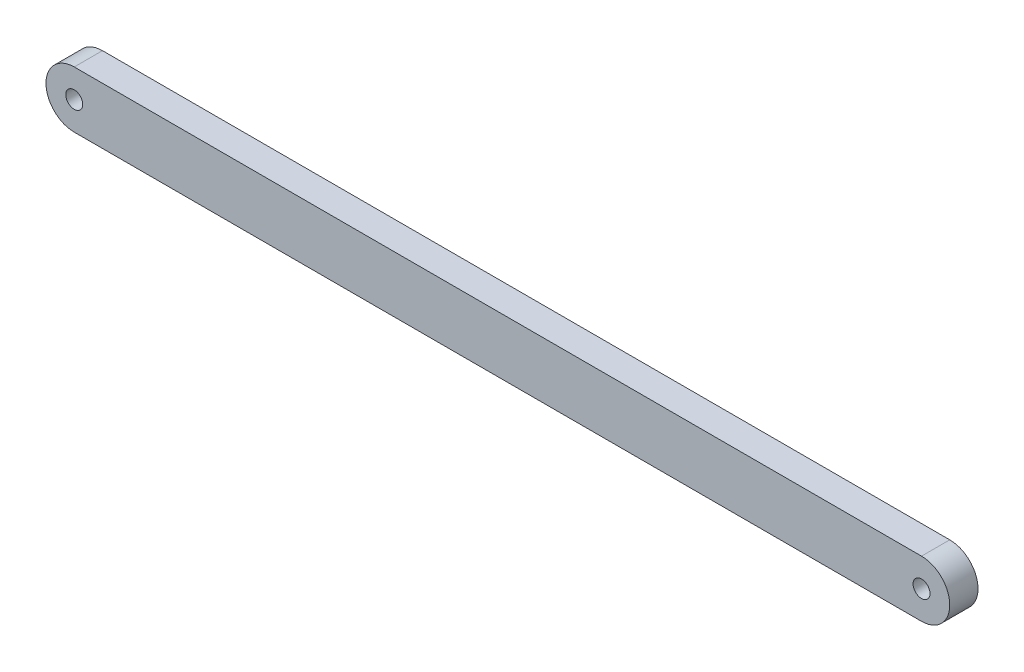
ISO-10303-21;
HEADER;
FILE_DESCRIPTION(('STEP AP214'),'2;1');
FILE_NAME('part.step','',(''),(''),'','','');
FILE_SCHEMA(('AUTOMOTIVE_DESIGN { 1 0 10303 214 1 1 1 1 }'));
ENDSEC;
DATA;
#1=APPLICATION_CONTEXT('core data for automotive mechanical design processes');
#2=APPLICATION_PROTOCOL_DEFINITION('international standard','automotive_design',2000,#1);
#3=PRODUCT_CONTEXT('',#1,'mechanical');
#4=PRODUCT('Part','Part','',(#3));
#5=PRODUCT_RELATED_PRODUCT_CATEGORY('part','',(#4));
#6=PRODUCT_DEFINITION_FORMATION('','',#4);
#7=PRODUCT_DEFINITION_CONTEXT('part definition',#1,'design');
#8=PRODUCT_DEFINITION('design','',#6,#7);
#9=PRODUCT_DEFINITION_SHAPE('','',#8);
#10=(LENGTH_UNIT() NAMED_UNIT(*) SI_UNIT(.MILLI.,.METRE.));
#11=(NAMED_UNIT(*) PLANE_ANGLE_UNIT() SI_UNIT($,.RADIAN.));
#12=(NAMED_UNIT(*) SI_UNIT($,.STERADIAN.) SOLID_ANGLE_UNIT());
#13=UNCERTAINTY_MEASURE_WITH_UNIT(LENGTH_MEASURE(1.E-05),#10,'distance_accuracy_value','');
#14=(GEOMETRIC_REPRESENTATION_CONTEXT(3) GLOBAL_UNCERTAINTY_ASSIGNED_CONTEXT((#13)) GLOBAL_UNIT_ASSIGNED_CONTEXT((#10,
#11,#12)) REPRESENTATION_CONTEXT('',''));
#15=CARTESIAN_POINT('',(0.,0.,0.));
#16=DIRECTION('',(0.,0.,1.));
#17=DIRECTION('',(1.,0.,0.));
#18=AXIS2_PLACEMENT_3D('',#15,#16,#17);
#19=CARTESIAN_POINT('',(-75.,0.,5.));
#20=DIRECTION('',(0.,0.,1.));
#21=DIRECTION('',(1.,0.,0.));
#22=AXIS2_PLACEMENT_3D('',#19,#20,#21);
#23=PLANE('',#22);
#24=CARTESIAN_POINT('',(-75.,0.,5.));
#25=DIRECTION('',(0.,0.,1.));
#26=DIRECTION('',(1.,0.,0.));
#27=AXIS2_PLACEMENT_3D('',#24,#25,#26);
#28=CIRCLE('',#27,1.5);
#29=CARTESIAN_POINT('',(-73.5,0.,5.));
#30=VERTEX_POINT('',#29);
#31=EDGE_CURVE('E104',#30,#30,#28,.T.);
#32=ORIENTED_EDGE('',*,*,#31,.F.);
#33=EDGE_LOOP('',(#32));
#34=FACE_BOUND('',#33,.T.);
#35=CARTESIAN_POINT('',(-75.,0.,5.));
#36=DIRECTION('',(0.,0.,1.));
#37=DIRECTION('',(1.,0.,0.));
#38=AXIS2_PLACEMENT_3D('',#35,#36,#37);
#39=CIRCLE('',#38,5.);
#40=CARTESIAN_POINT('',(-75.,5.,5.));
#41=VERTEX_POINT('',#40);
#42=CARTESIAN_POINT('',(-75.,-5.,5.));
#43=VERTEX_POINT('',#42);
#44=EDGE_CURVE('E89',#41,#43,#39,.T.);
#45=ORIENTED_EDGE('',*,*,#44,.T.);
#46=DIRECTION('',(1.,0.,0.));
#47=VECTOR('',#46,1.);
#48=CARTESIAN_POINT('',(-75.,-5.,5.));
#49=LINE('',#48,#47);
#50=CARTESIAN_POINT('',(75.,-5.,5.));
#51=VERTEX_POINT('',#50);
#52=EDGE_CURVE('E84',#43,#51,#49,.T.);
#53=ORIENTED_EDGE('',*,*,#52,.T.);
#54=CARTESIAN_POINT('',(75.,0.,5.));
#55=DIRECTION('',(0.,0.,1.));
#56=DIRECTION('',(1.,0.,0.));
#57=AXIS2_PLACEMENT_3D('',#54,#55,#56);
#58=CIRCLE('',#57,5.);
#59=CARTESIAN_POINT('',(75.,5.,5.));
#60=VERTEX_POINT('',#59);
#61=EDGE_CURVE('E87',#51,#60,#58,.T.);
#62=ORIENTED_EDGE('',*,*,#61,.T.);
#63=DIRECTION('',(-1.,0.,0.));
#64=VECTOR('',#63,1.);
#65=CARTESIAN_POINT('',(-75.,5.,5.));
#66=LINE('',#65,#64);
#67=EDGE_CURVE('E54',#60,#41,#66,.T.);
#68=ORIENTED_EDGE('',*,*,#67,.T.);
#69=EDGE_LOOP('',(#45,#53,#62,#68));
#70=FACE_BOUND('',#69,.T.);
#71=CARTESIAN_POINT('',(75.,0.,5.));
#72=DIRECTION('',(0.,0.,1.));
#73=DIRECTION('',(1.,0.,0.));
#74=AXIS2_PLACEMENT_3D('',#71,#72,#73);
#75=CIRCLE('',#74,1.5);
#76=CARTESIAN_POINT('',(76.5,0.,5.));
#77=VERTEX_POINT('',#76);
#78=EDGE_CURVE('E119',#77,#77,#75,.T.);
#79=ORIENTED_EDGE('',*,*,#78,.F.);
#80=EDGE_LOOP('',(#79));
#81=FACE_BOUND('',#80,.T.);
#82=ADVANCED_FACE('F37',(#34,#70,#81),#23,.T.);
#83=CARTESIAN_POINT('',(-75.,0.,0.));
#84=DIRECTION('',(0.,0.,1.));
#85=DIRECTION('',(1.,0.,0.));
#86=AXIS2_PLACEMENT_3D('',#83,#84,#85);
#87=PLANE('',#86);
#88=CARTESIAN_POINT('',(-75.,0.,0.));
#89=DIRECTION('',(0.,0.,1.));
#90=DIRECTION('',(1.,0.,0.));
#91=AXIS2_PLACEMENT_3D('',#88,#89,#90);
#92=CIRCLE('',#91,5.);
#93=CARTESIAN_POINT('',(-75.,5.,0.));
#94=VERTEX_POINT('',#93);
#95=CARTESIAN_POINT('',(-75.,-5.,0.));
#96=VERTEX_POINT('',#95);
#97=EDGE_CURVE('E101',#94,#96,#92,.T.);
#98=ORIENTED_EDGE('',*,*,#97,.F.);
#99=DIRECTION('',(-1.,0.,0.));
#100=VECTOR('',#99,1.);
#101=CARTESIAN_POINT('',(-75.,5.,0.));
#102=LINE('',#101,#100);
#103=CARTESIAN_POINT('',(75.,5.,0.));
#104=VERTEX_POINT('',#103);
#105=EDGE_CURVE('E77',#104,#94,#102,.T.);
#106=ORIENTED_EDGE('',*,*,#105,.F.);
#107=CARTESIAN_POINT('',(75.,0.,0.));
#108=DIRECTION('',(0.,0.,1.));
#109=DIRECTION('',(1.,0.,0.));
#110=AXIS2_PLACEMENT_3D('',#107,#108,#109);
#111=CIRCLE('',#110,5.);
#112=CARTESIAN_POINT('',(75.,-5.,0.));
#113=VERTEX_POINT('',#112);
#114=EDGE_CURVE('E71',#113,#104,#111,.T.);
#115=ORIENTED_EDGE('',*,*,#114,.F.);
#116=DIRECTION('',(1.,0.,0.));
#117=VECTOR('',#116,1.);
#118=CARTESIAN_POINT('',(-75.,-5.,0.));
#119=LINE('',#118,#117);
#120=EDGE_CURVE('E93',#96,#113,#119,.T.);
#121=ORIENTED_EDGE('',*,*,#120,.F.);
#122=EDGE_LOOP('',(#98,#106,#115,#121));
#123=FACE_BOUND('',#122,.T.);
#124=CARTESIAN_POINT('',(-75.,0.,0.));
#125=DIRECTION('',(0.,0.,1.));
#126=DIRECTION('',(1.,0.,0.));
#127=AXIS2_PLACEMENT_3D('',#124,#125,#126);
#128=CIRCLE('',#127,1.5);
#129=CARTESIAN_POINT('',(-73.5,0.,0.));
#130=VERTEX_POINT('',#129);
#131=EDGE_CURVE('E116',#130,#130,#128,.T.);
#132=ORIENTED_EDGE('',*,*,#131,.T.);
#133=EDGE_LOOP('',(#132));
#134=FACE_BOUND('',#133,.T.);
#135=CARTESIAN_POINT('',(75.,0.,0.));
#136=DIRECTION('',(0.,0.,1.));
#137=DIRECTION('',(1.,0.,0.));
#138=AXIS2_PLACEMENT_3D('',#135,#136,#137);
#139=CIRCLE('',#138,1.5);
#140=CARTESIAN_POINT('',(76.5,0.,0.));
#141=VERTEX_POINT('',#140);
#142=EDGE_CURVE('E122',#141,#141,#139,.T.);
#143=ORIENTED_EDGE('',*,*,#142,.T.);
#144=EDGE_LOOP('',(#143));
#145=FACE_BOUND('',#144,.T.);
#146=ADVANCED_FACE('F112',(#123,#134,#145),#87,.F.);
#147=CARTESIAN_POINT('',(-75.,0.,5.));
#148=DIRECTION('',(0.,0.,-1.));
#149=DIRECTION('',(-1.,0.,0.));
#150=AXIS2_PLACEMENT_3D('',#147,#148,#149);
#151=CYLINDRICAL_SURFACE('',#150,5.);
#152=ORIENTED_EDGE('',*,*,#97,.T.);
#153=DIRECTION('',(0.,0.,-1.));
#154=VECTOR('',#153,1.);
#155=CARTESIAN_POINT('',(-75.,-5.,5.));
#156=LINE('',#155,#154);
#157=EDGE_CURVE('E11',#43,#96,#156,.T.);
#158=ORIENTED_EDGE('',*,*,#157,.F.);
#159=ORIENTED_EDGE('',*,*,#44,.F.);
#160=DIRECTION('',(0.,0.,-1.));
#161=VECTOR('',#160,1.);
#162=CARTESIAN_POINT('',(-75.,5.,5.));
#163=LINE('',#162,#161);
#164=EDGE_CURVE('E97',#41,#94,#163,.T.);
#165=ORIENTED_EDGE('',*,*,#164,.T.);
#166=EDGE_LOOP('',(#152,#158,#159,#165));
#167=FACE_BOUND('',#166,.T.);
#168=ADVANCED_FACE('F39',(#167),#151,.T.);
#169=CARTESIAN_POINT('',(-75.,-5.,5.));
#170=DIRECTION('',(0.,1.,0.));
#171=DIRECTION('',(0.,0.,1.));
#172=AXIS2_PLACEMENT_3D('',#169,#170,#171);
#173=PLANE('',#172);
#174=ORIENTED_EDGE('',*,*,#120,.T.);
#175=DIRECTION('',(0.,0.,-1.));
#176=VECTOR('',#175,1.);
#177=CARTESIAN_POINT('',(75.,-5.,5.));
#178=LINE('',#177,#176);
#179=EDGE_CURVE('E46',#51,#113,#178,.T.);
#180=ORIENTED_EDGE('',*,*,#179,.F.);
#181=ORIENTED_EDGE('',*,*,#52,.F.);
#182=ORIENTED_EDGE('',*,*,#157,.T.);
#183=EDGE_LOOP('',(#174,#180,#181,#182));
#184=FACE_BOUND('',#183,.T.);
#185=ADVANCED_FACE('F92',(#184),#173,.F.);
#186=CARTESIAN_POINT('',(75.,0.,5.));
#187=DIRECTION('',(0.,0.,-1.));
#188=DIRECTION('',(-1.,0.,0.));
#189=AXIS2_PLACEMENT_3D('',#186,#187,#188);
#190=CYLINDRICAL_SURFACE('',#189,5.);
#191=ORIENTED_EDGE('',*,*,#114,.T.);
#192=DIRECTION('',(0.,0.,-1.));
#193=VECTOR('',#192,1.);
#194=CARTESIAN_POINT('',(75.,5.,5.));
#195=LINE('',#194,#193);
#196=EDGE_CURVE('E94',#60,#104,#195,.T.);
#197=ORIENTED_EDGE('',*,*,#196,.F.);
#198=ORIENTED_EDGE('',*,*,#61,.F.);
#199=ORIENTED_EDGE('',*,*,#179,.T.);
#200=EDGE_LOOP('',(#191,#197,#198,#199));
#201=FACE_BOUND('',#200,.T.);
#202=ADVANCED_FACE('F95',(#201),#190,.T.);
#203=CARTESIAN_POINT('',(-75.,5.,5.));
#204=DIRECTION('',(0.,-1.,0.));
#205=DIRECTION('',(0.,0.,-1.));
#206=AXIS2_PLACEMENT_3D('',#203,#204,#205);
#207=PLANE('',#206);
#208=ORIENTED_EDGE('',*,*,#105,.T.);
#209=ORIENTED_EDGE('',*,*,#164,.F.);
#210=ORIENTED_EDGE('',*,*,#67,.F.);
#211=ORIENTED_EDGE('',*,*,#196,.T.);
#212=EDGE_LOOP('',(#208,#209,#210,#211));
#213=FACE_BOUND('',#212,.T.);
#214=ADVANCED_FACE('F109',(#213),#207,.F.);
#215=CARTESIAN_POINT('',(-75.,0.,5.));
#216=DIRECTION('',(0.,0.,-1.));
#217=DIRECTION('',(-1.,0.,0.));
#218=AXIS2_PLACEMENT_3D('',#215,#216,#217);
#219=CYLINDRICAL_SURFACE('',#218,1.5);
#220=ORIENTED_EDGE('',*,*,#31,.T.);
#221=EDGE_LOOP('',(#220));
#222=FACE_BOUND('',#221,.T.);
#223=ORIENTED_EDGE('',*,*,#131,.F.);
#224=EDGE_LOOP('',(#223));
#225=FACE_BOUND('',#224,.T.);
#226=ADVANCED_FACE('F139',(#222,#225),#219,.F.);
#227=CARTESIAN_POINT('',(75.,0.,5.));
#228=DIRECTION('',(0.,0.,-1.));
#229=DIRECTION('',(-1.,0.,0.));
#230=AXIS2_PLACEMENT_3D('',#227,#228,#229);
#231=CYLINDRICAL_SURFACE('',#230,1.5);
#232=ORIENTED_EDGE('',*,*,#78,.T.);
#233=EDGE_LOOP('',(#232));
#234=FACE_BOUND('',#233,.T.);
#235=ORIENTED_EDGE('',*,*,#142,.F.);
#236=EDGE_LOOP('',(#235));
#237=FACE_BOUND('',#236,.T.);
#238=ADVANCED_FACE('F128',(#234,#237),#231,.F.);
#239=CLOSED_SHELL('',(#82,#146,#168,#185,#202,#214,#226,#238));
#240=MANIFOLD_SOLID_BREP('B2',#239);
#241=ADVANCED_BREP_SHAPE_REPRESENTATION('',(#18,#240),#14);
#242=SHAPE_DEFINITION_REPRESENTATION(#9,#241);
ENDSEC;
END-ISO-10303-21;
